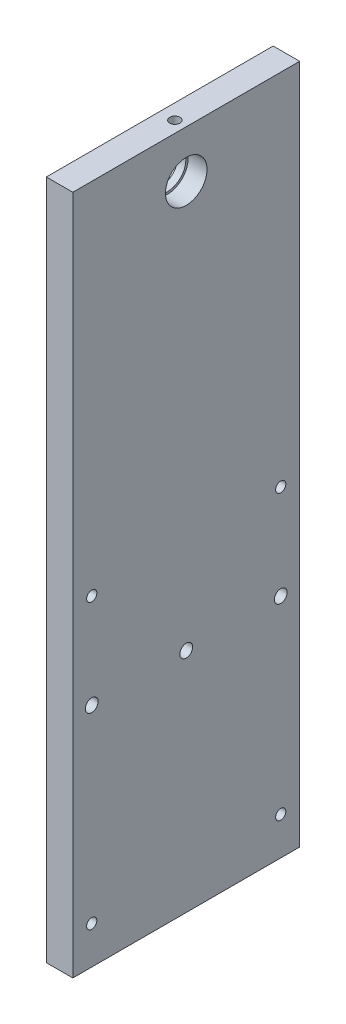
ISO-10303-21;
HEADER;
FILE_DESCRIPTION(('STEP AP214'),'2;1');
FILE_NAME('part.step','',(''),(''),'','','');
FILE_SCHEMA(('AUTOMOTIVE_DESIGN { 1 0 10303 214 1 1 1 1 }'));
ENDSEC;
DATA;
#1=APPLICATION_CONTEXT('core data for automotive mechanical design processes');
#2=APPLICATION_PROTOCOL_DEFINITION('international standard','automotive_design',2000,#1);
#3=PRODUCT_CONTEXT('',#1,'mechanical');
#4=PRODUCT('Part','Part','',(#3));
#5=PRODUCT_RELATED_PRODUCT_CATEGORY('part','',(#4));
#6=PRODUCT_DEFINITION_FORMATION('','',#4);
#7=PRODUCT_DEFINITION_CONTEXT('part definition',#1,'design');
#8=PRODUCT_DEFINITION('design','',#6,#7);
#9=PRODUCT_DEFINITION_SHAPE('','',#8);
#10=(LENGTH_UNIT() NAMED_UNIT(*) SI_UNIT(.MILLI.,.METRE.));
#11=(NAMED_UNIT(*) PLANE_ANGLE_UNIT() SI_UNIT($,.RADIAN.));
#12=(NAMED_UNIT(*) SI_UNIT($,.STERADIAN.) SOLID_ANGLE_UNIT());
#13=UNCERTAINTY_MEASURE_WITH_UNIT(LENGTH_MEASURE(1.E-05),#10,'distance_accuracy_value','');
#14=(GEOMETRIC_REPRESENTATION_CONTEXT(3) GLOBAL_UNCERTAINTY_ASSIGNED_CONTEXT((#13)) GLOBAL_UNIT_ASSIGNED_CONTEXT((#10,
#11,#12)) REPRESENTATION_CONTEXT('',''));
#15=CARTESIAN_POINT('',(0.,0.,0.));
#16=DIRECTION('',(0.,0.,1.));
#17=DIRECTION('',(1.,0.,0.));
#18=AXIS2_PLACEMENT_3D('',#15,#16,#17);
#19=CARTESIAN_POINT('',(7.,-90.,-30.));
#20=DIRECTION('',(0.,0.,1.));
#21=DIRECTION('',(1.,0.,0.));
#22=AXIS2_PLACEMENT_3D('',#19,#20,#21);
#23=PLANE('',#22);
#24=DIRECTION('',(0.,1.,0.));
#25=VECTOR('',#24,1.);
#26=CARTESIAN_POINT('',(0.,-90.,-30.));
#27=LINE('',#26,#25);
#28=CARTESIAN_POINT('',(0.,-90.,-30.));
#29=VERTEX_POINT('',#28);
#30=CARTESIAN_POINT('',(0.,90.,-30.));
#31=VERTEX_POINT('',#30);
#32=EDGE_CURVE('E192',#29,#31,#27,.T.);
#33=ORIENTED_EDGE('',*,*,#32,.T.);
#34=DIRECTION('',(-1.,0.,0.));
#35=VECTOR('',#34,1.);
#36=CARTESIAN_POINT('',(7.,90.,-30.));
#37=LINE('',#36,#35);
#38=CARTESIAN_POINT('',(7.,90.,-30.));
#39=VERTEX_POINT('',#38);
#40=EDGE_CURVE('E11',#39,#31,#37,.T.);
#41=ORIENTED_EDGE('',*,*,#40,.F.);
#42=DIRECTION('',(0.,1.,0.));
#43=VECTOR('',#42,1.);
#44=CARTESIAN_POINT('',(7.,-90.,-30.));
#45=LINE('',#44,#43);
#46=CARTESIAN_POINT('',(7.,-90.,-30.));
#47=VERTEX_POINT('',#46);
#48=EDGE_CURVE('E208',#47,#39,#45,.T.);
#49=ORIENTED_EDGE('',*,*,#48,.F.);
#50=DIRECTION('',(-1.,0.,0.));
#51=VECTOR('',#50,1.);
#52=CARTESIAN_POINT('',(7.,-90.,-30.));
#53=LINE('',#52,#51);
#54=EDGE_CURVE('E194',#47,#29,#53,.T.);
#55=ORIENTED_EDGE('',*,*,#54,.T.);
#56=EDGE_LOOP('',(#33,#41,#49,#55));
#57=FACE_BOUND('',#56,.T.);
#58=ADVANCED_FACE('F37',(#57),#23,.F.);
#59=CARTESIAN_POINT('',(7.,90.,30.));
#60=DIRECTION('',(0.,-1.,0.));
#61=DIRECTION('',(0.,0.,-1.));
#62=AXIS2_PLACEMENT_3D('',#59,#60,#61);
#63=PLANE('',#62);
#64=CARTESIAN_POINT('',(4.,90.,0.));
#65=DIRECTION('',(0.,1.,0.));
#66=DIRECTION('',(0.,0.,1.));
#67=AXIS2_PLACEMENT_3D('',#64,#65,#66);
#68=CIRCLE('',#67,1.35);
#69=CARTESIAN_POINT('',(4.,90.,1.35));
#70=VERTEX_POINT('',#69);
#71=EDGE_CURVE('E125',#70,#70,#68,.T.);
#72=ORIENTED_EDGE('',*,*,#71,.F.);
#73=EDGE_LOOP('',(#72));
#74=FACE_BOUND('',#73,.T.);
#75=DIRECTION('',(0.,0.,1.));
#76=VECTOR('',#75,1.);
#77=CARTESIAN_POINT('',(0.,90.,30.));
#78=LINE('',#77,#76);
#79=CARTESIAN_POINT('',(0.,90.,30.));
#80=VERTEX_POINT('',#79);
#81=EDGE_CURVE('E196',#31,#80,#78,.T.);
#82=ORIENTED_EDGE('',*,*,#81,.T.);
#83=DIRECTION('',(-1.,0.,0.));
#84=VECTOR('',#83,1.);
#85=CARTESIAN_POINT('',(7.,90.,30.));
#86=LINE('',#85,#84);
#87=CARTESIAN_POINT('',(7.,90.,30.));
#88=VERTEX_POINT('',#87);
#89=EDGE_CURVE('E46',#88,#80,#86,.T.);
#90=ORIENTED_EDGE('',*,*,#89,.F.);
#91=DIRECTION('',(0.,0.,1.));
#92=VECTOR('',#91,1.);
#93=CARTESIAN_POINT('',(7.,90.,30.));
#94=LINE('',#93,#92);
#95=EDGE_CURVE('E86',#39,#88,#94,.T.);
#96=ORIENTED_EDGE('',*,*,#95,.F.);
#97=ORIENTED_EDGE('',*,*,#40,.T.);
#98=EDGE_LOOP('',(#82,#90,#96,#97));
#99=FACE_BOUND('',#98,.T.);
#100=ADVANCED_FACE('F182',(#74,#99),#63,.F.);
#101=CARTESIAN_POINT('',(7.,-90.,30.));
#102=DIRECTION('',(0.,0.,-1.));
#103=DIRECTION('',(-1.,0.,0.));
#104=AXIS2_PLACEMENT_3D('',#101,#102,#103);
#105=PLANE('',#104);
#106=DIRECTION('',(0.,-1.,0.));
#107=VECTOR('',#106,1.);
#108=CARTESIAN_POINT('',(0.,-90.,30.));
#109=LINE('',#108,#107);
#110=CARTESIAN_POINT('',(0.,-90.,30.));
#111=VERTEX_POINT('',#110);
#112=EDGE_CURVE('E73',#80,#111,#109,.T.);
#113=ORIENTED_EDGE('',*,*,#112,.T.);
#114=DIRECTION('',(-1.,0.,0.));
#115=VECTOR('',#114,1.);
#116=CARTESIAN_POINT('',(7.,-90.,30.));
#117=LINE('',#116,#115);
#118=CARTESIAN_POINT('',(7.,-90.,30.));
#119=VERTEX_POINT('',#118);
#120=EDGE_CURVE('E210',#119,#111,#117,.T.);
#121=ORIENTED_EDGE('',*,*,#120,.F.);
#122=DIRECTION('',(0.,-1.,0.));
#123=VECTOR('',#122,1.);
#124=CARTESIAN_POINT('',(7.,-90.,30.));
#125=LINE('',#124,#123);
#126=EDGE_CURVE('E243',#88,#119,#125,.T.);
#127=ORIENTED_EDGE('',*,*,#126,.F.);
#128=ORIENTED_EDGE('',*,*,#89,.T.);
#129=EDGE_LOOP('',(#113,#121,#127,#128));
#130=FACE_BOUND('',#129,.T.);
#131=ADVANCED_FACE('F187',(#130),#105,.F.);
#132=CARTESIAN_POINT('',(7.,-90.,30.));
#133=DIRECTION('',(0.,1.,0.));
#134=DIRECTION('',(0.,0.,1.));
#135=AXIS2_PLACEMENT_3D('',#132,#133,#134);
#136=PLANE('',#135);
#137=CARTESIAN_POINT('',(3.5,-90.,-25.));
#138=DIRECTION('',(0.,-1.,0.));
#139=DIRECTION('',(0.,0.,-1.));
#140=AXIS2_PLACEMENT_3D('',#137,#138,#139);
#141=CIRCLE('',#140,1.35);
#142=CARTESIAN_POINT('',(3.5,-90.,-26.35));
#143=VERTEX_POINT('',#142);
#144=EDGE_CURVE('E107',#143,#143,#141,.T.);
#145=ORIENTED_EDGE('',*,*,#144,.F.);
#146=EDGE_LOOP('',(#145));
#147=FACE_BOUND('',#146,.T.);
#148=CARTESIAN_POINT('',(3.5,-90.,0.));
#149=DIRECTION('',(0.,-1.,0.));
#150=DIRECTION('',(0.,0.,-1.));
#151=AXIS2_PLACEMENT_3D('',#148,#149,#150);
#152=CIRCLE('',#151,1.35);
#153=CARTESIAN_POINT('',(3.5,-90.,-1.35));
#154=VERTEX_POINT('',#153);
#155=EDGE_CURVE('E106',#154,#154,#152,.T.);
#156=ORIENTED_EDGE('',*,*,#155,.F.);
#157=EDGE_LOOP('',(#156));
#158=FACE_BOUND('',#157,.T.);
#159=CARTESIAN_POINT('',(3.5,-90.,25.));
#160=DIRECTION('',(0.,-1.,0.));
#161=DIRECTION('',(0.,0.,-1.));
#162=AXIS2_PLACEMENT_3D('',#159,#160,#161);
#163=CIRCLE('',#162,1.35);
#164=CARTESIAN_POINT('',(3.5,-90.,23.65));
#165=VERTEX_POINT('',#164);
#166=EDGE_CURVE('E119',#165,#165,#163,.T.);
#167=ORIENTED_EDGE('',*,*,#166,.F.);
#168=EDGE_LOOP('',(#167));
#169=FACE_BOUND('',#168,.T.);
#170=DIRECTION('',(0.,0.,-1.));
#171=VECTOR('',#170,1.);
#172=CARTESIAN_POINT('',(0.,-90.,30.));
#173=LINE('',#172,#171);
#174=EDGE_CURVE('E79',#111,#29,#173,.T.);
#175=ORIENTED_EDGE('',*,*,#174,.T.);
#176=ORIENTED_EDGE('',*,*,#54,.F.);
#177=DIRECTION('',(0.,0.,-1.));
#178=VECTOR('',#177,1.);
#179=CARTESIAN_POINT('',(7.,-90.,30.));
#180=LINE('',#179,#178);
#181=EDGE_CURVE('E55',#119,#47,#180,.T.);
#182=ORIENTED_EDGE('',*,*,#181,.F.);
#183=ORIENTED_EDGE('',*,*,#120,.T.);
#184=EDGE_LOOP('',(#175,#176,#182,#183));
#185=FACE_BOUND('',#184,.T.);
#186=ADVANCED_FACE('F246',(#147,#158,#169,#185),#136,.F.);
#187=CARTESIAN_POINT('',(7.,0.,0.));
#188=DIRECTION('',(-1.,0.,0.));
#189=DIRECTION('',(0.,0.,1.));
#190=AXIS2_PLACEMENT_3D('',#187,#188,#189);
#191=PLANE('',#190);
#192=CARTESIAN_POINT('',(7.,-4.99999999999999,25.));
#193=DIRECTION('',(-1.,0.,0.));
#194=DIRECTION('',(0.,0.,1.));
#195=AXIS2_PLACEMENT_3D('',#192,#193,#194);
#196=CIRCLE('',#195,1.35);
#197=CARTESIAN_POINT('',(7.,-4.99999999999999,26.35));
#198=VERTEX_POINT('',#197);
#199=EDGE_CURVE('E530',#198,#198,#196,.T.);
#200=ORIENTED_EDGE('',*,*,#199,.T.);
#201=EDGE_LOOP('',(#200));
#202=FACE_BOUND('',#201,.T.);
#203=CARTESIAN_POINT('',(7.,-80.,25.));
#204=DIRECTION('',(-1.,0.,0.));
#205=DIRECTION('',(0.,0.,1.));
#206=AXIS2_PLACEMENT_3D('',#203,#204,#205);
#207=CIRCLE('',#206,1.35);
#208=CARTESIAN_POINT('',(7.,-80.,26.35));
#209=VERTEX_POINT('',#208);
#210=EDGE_CURVE('E526',#209,#209,#207,.T.);
#211=ORIENTED_EDGE('',*,*,#210,.T.);
#212=EDGE_LOOP('',(#211));
#213=FACE_BOUND('',#212,.T.);
#214=CARTESIAN_POINT('',(7.,-80.,-25.));
#215=DIRECTION('',(-1.,0.,0.));
#216=DIRECTION('',(0.,0.,1.));
#217=AXIS2_PLACEMENT_3D('',#214,#215,#216);
#218=CIRCLE('',#217,1.35);
#219=CARTESIAN_POINT('',(7.,-80.,-23.65));
#220=VERTEX_POINT('',#219);
#221=EDGE_CURVE('E519',#220,#220,#218,.T.);
#222=ORIENTED_EDGE('',*,*,#221,.T.);
#223=EDGE_LOOP('',(#222));
#224=FACE_BOUND('',#223,.T.);
#225=CARTESIAN_POINT('',(7.,-4.99999999999999,-25.));
#226=DIRECTION('',(-1.,0.,0.));
#227=DIRECTION('',(0.,0.,1.));
#228=AXIS2_PLACEMENT_3D('',#225,#226,#227);
#229=CIRCLE('',#228,1.35);
#230=CARTESIAN_POINT('',(7.,-4.99999999999999,-23.65));
#231=VERTEX_POINT('',#230);
#232=EDGE_CURVE('E113',#231,#231,#229,.T.);
#233=ORIENTED_EDGE('',*,*,#232,.T.);
#234=EDGE_LOOP('',(#233));
#235=FACE_BOUND('',#234,.T.);
#236=CARTESIAN_POINT('',(7.,-30.,-25.));
#237=DIRECTION('',(-1.,0.,0.));
#238=DIRECTION('',(0.,0.,1.));
#239=AXIS2_PLACEMENT_3D('',#236,#237,#238);
#240=CIRCLE('',#239,1.69999999999999);
#241=CARTESIAN_POINT('',(7.,-30.,-23.3));
#242=VERTEX_POINT('',#241);
#243=EDGE_CURVE('E40',#242,#242,#240,.T.);
#244=ORIENTED_EDGE('',*,*,#243,.T.);
#245=EDGE_LOOP('',(#244));
#246=FACE_BOUND('',#245,.T.);
#247=CARTESIAN_POINT('',(7.,-30.,0.));
#248=DIRECTION('',(-1.,0.,0.));
#249=DIRECTION('',(0.,0.,1.));
#250=AXIS2_PLACEMENT_3D('',#247,#248,#249);
#251=CIRCLE('',#250,1.69999999999999);
#252=CARTESIAN_POINT('',(7.,-30.,1.69999999999999));
#253=VERTEX_POINT('',#252);
#254=EDGE_CURVE('E217',#253,#253,#251,.T.);
#255=ORIENTED_EDGE('',*,*,#254,.T.);
#256=EDGE_LOOP('',(#255));
#257=FACE_BOUND('',#256,.T.);
#258=CARTESIAN_POINT('',(7.,-30.,25.));
#259=DIRECTION('',(-1.,0.,0.));
#260=DIRECTION('',(0.,0.,1.));
#261=AXIS2_PLACEMENT_3D('',#258,#259,#260);
#262=CIRCLE('',#261,1.69999999999999);
#263=CARTESIAN_POINT('',(7.,-30.,26.7));
#264=VERTEX_POINT('',#263);
#265=EDGE_CURVE('E213',#264,#264,#262,.T.);
#266=ORIENTED_EDGE('',*,*,#265,.T.);
#267=EDGE_LOOP('',(#266));
#268=FACE_BOUND('',#267,.T.);
#269=CARTESIAN_POINT('',(7.,77.5,0.));
#270=DIRECTION('',(1.,0.,0.));
#271=DIRECTION('',(0.,0.,-1.));
#272=AXIS2_PLACEMENT_3D('',#269,#270,#271);
#273=CIRCLE('',#272,5.5);
#274=CARTESIAN_POINT('',(7.,77.5,-5.5));
#275=VERTEX_POINT('',#274);
#276=EDGE_CURVE('E201',#275,#275,#273,.T.);
#277=ORIENTED_EDGE('',*,*,#276,.F.);
#278=EDGE_LOOP('',(#277));
#279=FACE_BOUND('',#278,.T.);
#280=ORIENTED_EDGE('',*,*,#48,.T.);
#281=ORIENTED_EDGE('',*,*,#95,.T.);
#282=ORIENTED_EDGE('',*,*,#126,.T.);
#283=ORIENTED_EDGE('',*,*,#181,.T.);
#284=EDGE_LOOP('',(#280,#281,#282,#283));
#285=FACE_BOUND('',#284,.T.);
#286=ADVANCED_FACE('F245',(#202,#213,#224,#235,#246,#257,#268,#279,#285),#191,.F.);
#287=CARTESIAN_POINT('',(0.,0.,0.));
#288=DIRECTION('',(-1.,0.,0.));
#289=DIRECTION('',(0.,0.,1.));
#290=AXIS2_PLACEMENT_3D('',#287,#288,#289);
#291=PLANE('',#290);
#292=CARTESIAN_POINT('',(0.,-4.99999999999999,25.));
#293=DIRECTION('',(-1.,0.,0.));
#294=DIRECTION('',(0.,0.,1.));
#295=AXIS2_PLACEMENT_3D('',#292,#293,#294);
#296=CIRCLE('',#295,1.35);
#297=CARTESIAN_POINT('',(0.,-4.99999999999999,26.35));
#298=VERTEX_POINT('',#297);
#299=EDGE_CURVE('E506',#298,#298,#296,.T.);
#300=ORIENTED_EDGE('',*,*,#299,.F.);
#301=EDGE_LOOP('',(#300));
#302=FACE_BOUND('',#301,.T.);
#303=CARTESIAN_POINT('',(0.,-80.,25.));
#304=DIRECTION('',(-1.,0.,0.));
#305=DIRECTION('',(0.,0.,1.));
#306=AXIS2_PLACEMENT_3D('',#303,#304,#305);
#307=CIRCLE('',#306,1.35);
#308=CARTESIAN_POINT('',(0.,-80.,26.35));
#309=VERTEX_POINT('',#308);
#310=EDGE_CURVE('E510',#309,#309,#307,.T.);
#311=ORIENTED_EDGE('',*,*,#310,.F.);
#312=EDGE_LOOP('',(#311));
#313=FACE_BOUND('',#312,.T.);
#314=CARTESIAN_POINT('',(0.,-80.,-25.));
#315=DIRECTION('',(-1.,0.,0.));
#316=DIRECTION('',(0.,0.,1.));
#317=AXIS2_PLACEMENT_3D('',#314,#315,#316);
#318=CIRCLE('',#317,1.35);
#319=CARTESIAN_POINT('',(0.,-80.,-23.65));
#320=VERTEX_POINT('',#319);
#321=EDGE_CURVE('E514',#320,#320,#318,.T.);
#322=ORIENTED_EDGE('',*,*,#321,.F.);
#323=EDGE_LOOP('',(#322));
#324=FACE_BOUND('',#323,.T.);
#325=CARTESIAN_POINT('',(0.,-4.99999999999999,-25.));
#326=DIRECTION('',(-1.,0.,0.));
#327=DIRECTION('',(0.,0.,1.));
#328=AXIS2_PLACEMENT_3D('',#325,#326,#327);
#329=CIRCLE('',#328,1.35);
#330=CARTESIAN_POINT('',(0.,-4.99999999999999,-23.65));
#331=VERTEX_POINT('',#330);
#332=EDGE_CURVE('E517',#331,#331,#329,.T.);
#333=ORIENTED_EDGE('',*,*,#332,.F.);
#334=EDGE_LOOP('',(#333));
#335=FACE_BOUND('',#334,.T.);
#336=CARTESIAN_POINT('',(0.,-30.,-25.));
#337=DIRECTION('',(-1.,0.,0.));
#338=DIRECTION('',(0.,0.,1.));
#339=AXIS2_PLACEMENT_3D('',#336,#337,#338);
#340=CIRCLE('',#339,3.15);
#341=CARTESIAN_POINT('',(0.,-30.,-21.85));
#342=VERTEX_POINT('',#341);
#343=EDGE_CURVE('E135',#342,#342,#340,.T.);
#344=ORIENTED_EDGE('',*,*,#343,.F.);
#345=EDGE_LOOP('',(#344));
#346=FACE_BOUND('',#345,.T.);
#347=CARTESIAN_POINT('',(0.,-30.,0.));
#348=DIRECTION('',(-1.,0.,0.));
#349=DIRECTION('',(0.,0.,1.));
#350=AXIS2_PLACEMENT_3D('',#347,#348,#349);
#351=CIRCLE('',#350,3.15);
#352=CARTESIAN_POINT('',(0.,-30.,3.15));
#353=VERTEX_POINT('',#352);
#354=EDGE_CURVE('E226',#353,#353,#351,.T.);
#355=ORIENTED_EDGE('',*,*,#354,.F.);
#356=EDGE_LOOP('',(#355));
#357=FACE_BOUND('',#356,.T.);
#358=CARTESIAN_POINT('',(0.,-30.,25.));
#359=DIRECTION('',(-1.,0.,0.));
#360=DIRECTION('',(0.,0.,1.));
#361=AXIS2_PLACEMENT_3D('',#358,#359,#360);
#362=CIRCLE('',#361,3.15);
#363=CARTESIAN_POINT('',(0.,-30.,28.15));
#364=VERTEX_POINT('',#363);
#365=EDGE_CURVE('E219',#364,#364,#362,.T.);
#366=ORIENTED_EDGE('',*,*,#365,.F.);
#367=EDGE_LOOP('',(#366));
#368=FACE_BOUND('',#367,.T.);
#369=CARTESIAN_POINT('',(0.,77.5,0.));
#370=DIRECTION('',(1.,0.,0.));
#371=DIRECTION('',(0.,0.,-1.));
#372=AXIS2_PLACEMENT_3D('',#369,#370,#371);
#373=CIRCLE('',#372,4.9);
#374=CARTESIAN_POINT('',(0.,77.5,-4.9));
#375=VERTEX_POINT('',#374);
#376=EDGE_CURVE('E235',#375,#375,#373,.T.);
#377=ORIENTED_EDGE('',*,*,#376,.T.);
#378=EDGE_LOOP('',(#377));
#379=FACE_BOUND('',#378,.T.);
#380=ORIENTED_EDGE('',*,*,#32,.F.);
#381=ORIENTED_EDGE('',*,*,#174,.F.);
#382=ORIENTED_EDGE('',*,*,#112,.F.);
#383=ORIENTED_EDGE('',*,*,#81,.F.);
#384=EDGE_LOOP('',(#380,#381,#382,#383));
#385=FACE_BOUND('',#384,.T.);
#386=ADVANCED_FACE('F254',(#302,#313,#324,#335,#346,#357,#368,#379,#385),#291,.T.);
#387=CARTESIAN_POINT('',(2.,77.5,0.));
#388=DIRECTION('',(1.,0.,0.));
#389=DIRECTION('',(0.,0.,-1.));
#390=AXIS2_PLACEMENT_3D('',#387,#388,#389);
#391=CYLINDRICAL_SURFACE('',#390,5.5);
#392=CARTESIAN_POINT('',(4.,82.8317445550214,1.35));
#393=CARTESIAN_POINT('',(4.07459404554228,82.8317460030496,1.34999780468861));
#394=CARTESIAN_POINT('',(4.14921268427218,82.8333270611656,1.34379642023362));
#395=CARTESIAN_POINT('',(4.29631034850242,82.8394650177074,1.31919235824953));
#396=CARTESIAN_POINT('',(4.36878805553909,82.8440237115171,1.30078231933421));
#397=CARTESIAN_POINT('',(4.50945489998974,82.8555702383644,1.25239008377342));
#398=CARTESIAN_POINT('',(4.57764931970242,82.8625550071543,1.22242247963624));
#399=CARTESIAN_POINT('',(4.70804925189844,82.8781628839995,1.15180985590368));
#400=CARTESIAN_POINT('',(4.77025456657645,82.8867860461389,1.11116448381323));
#401=CARTESIAN_POINT('',(4.88823057177394,82.9049038833024,1.01942910306189));
#402=CARTESIAN_POINT('',(4.9438554652346,82.9144120708667,0.968154225253445));
#403=CARTESIAN_POINT('',(5.04580835602827,82.9331112465526,0.857013678934214));
#404=CARTESIAN_POINT('',(5.09213550790031,82.9423022057653,0.797147230023986));
#405=CARTESIAN_POINT('',(5.17477135301243,82.9594805058321,0.669527331244809));
#406=CARTESIAN_POINT('',(5.21093727225865,82.9674500410681,0.601678829076576));
#407=CARTESIAN_POINT('',(5.27129642301976,82.9811336171398,0.460637452762032));
#408=CARTESIAN_POINT('',(5.29549135549065,82.9868479783896,0.387445339585715));
#409=CARTESIAN_POINT('',(5.3307560165024,82.9952818339813,0.239313788270514));
#410=CARTESIAN_POINT('',(5.34207321350537,82.9980577207999,0.164436529241063));
#411=CARTESIAN_POINT('',(5.35203747060492,83.000498201627,0.0137982099228753));
#412=CARTESIAN_POINT('',(5.35068633908424,83.000163239704,-0.0619627226808936));
#413=CARTESIAN_POINT('',(5.33553124765317,82.9964619144129,-0.210503074693486));
#414=CARTESIAN_POINT('',(5.32199434512563,82.9931605637975,-0.283311604089842));
#415=CARTESIAN_POINT('',(5.2832806686568,82.9839728460825,-0.425590436159458));
#416=CARTESIAN_POINT('',(5.25810328787283,82.9780863442143,-0.495060564586371));
#417=CARTESIAN_POINT('',(5.19660423625448,82.9642894959193,-0.629399929606702));
#418=CARTESIAN_POINT('',(5.16018658722455,82.9563618209599,-0.694223375749242));
#419=CARTESIAN_POINT('',(5.07731336566687,82.9393440323317,-0.816933122260442));
#420=CARTESIAN_POINT('',(5.03085610331682,82.9302537230789,-0.874818252250094));
#421=CARTESIAN_POINT('',(4.92778726514464,82.9116226103587,-0.983600387239492));
#422=CARTESIAN_POINT('',(4.87094224165007,82.9020762416116,-1.03427548315651));
#423=CARTESIAN_POINT('',(4.74946102220943,82.8838269074008,-1.12542201012341));
#424=CARTESIAN_POINT('',(4.68482448869826,82.8751239785084,-1.16589299884805));
#425=CARTESIAN_POINT('',(4.54917160587664,82.8595276850636,-1.23561772227967));
#426=CARTESIAN_POINT('',(4.4781276837543,82.8526426959882,-1.26481981503145));
#427=CARTESIAN_POINT('',(4.33192952394116,82.8415703509379,-1.31079803732961));
#428=CARTESIAN_POINT('',(4.25677613342307,82.8373824412138,-1.32757671768675));
#429=CARTESIAN_POINT('',(4.10654570733195,82.8322941697872,-1.3478673650254));
#430=CARTESIAN_POINT('',(4.03151557787121,82.8313127113433,-1.35170667221183));
#431=CARTESIAN_POINT('',(3.88188678506865,82.8325280215256,-1.34690423887276));
#432=CARTESIAN_POINT('',(3.80728808417937,82.8347245092638,-1.33826360140847));
#433=CARTESIAN_POINT('',(3.66184347728384,82.8419706814126,-1.30903313486459));
#434=CARTESIAN_POINT('',(3.59095712642133,82.8469752072159,-1.28863229355618));
#435=CARTESIAN_POINT('',(3.4536100628248,82.8592310238128,-1.23666930120605));
#436=CARTESIAN_POINT('',(3.38714986071415,82.866482573291,-1.20510586503111));
#437=CARTESIAN_POINT('',(3.25915015106879,82.8825872478439,-1.13102304528637));
#438=CARTESIAN_POINT('',(3.19772801442858,82.8914681646624,-1.08830704308625));
#439=CARTESIAN_POINT('',(3.0828032982913,82.9097619766563,-0.993381558501934));
#440=CARTESIAN_POINT('',(3.02930197371111,82.919174955802,-0.941170574714357));
#441=CARTESIAN_POINT('',(2.93042011982838,82.9377459872019,-0.827238089249232));
#442=CARTESIAN_POINT('',(2.8852655443547,82.9468924835964,-0.76531825276484));
#443=CARTESIAN_POINT('',(2.8059961025652,82.9636653749563,-0.63458432139681));
#444=CARTESIAN_POINT('',(2.77188066643723,82.9712918483735,-0.565770582598971));
#445=CARTESIAN_POINT('',(2.71594867747293,82.9841178391087,-0.423673158542756));
#446=CARTESIAN_POINT('',(2.69404489670396,82.9893345223853,-0.350425429906179));
#447=CARTESIAN_POINT('',(2.66289421984003,82.9968281760098,-0.201144300271241));
#448=CARTESIAN_POINT('',(2.65364497482473,82.999105691918,-0.125111418940748));
#449=CARTESIAN_POINT('',(2.64819405112427,83.000443052028,0.0254557407383851));
#450=CARTESIAN_POINT('',(2.65165835303451,82.9995852713922,0.0999773817699713));
#451=CARTESIAN_POINT('',(2.67077387021999,82.9949301430865,0.24734206909767));
#452=CARTESIAN_POINT('',(2.68642474666354,82.991132877145,0.320185162005634));
#453=CARTESIAN_POINT('',(2.7292927234215,82.9810371975396,0.461789217233674));
#454=CARTESIAN_POINT('',(2.75645138836129,82.9747514306778,0.530568830035222));
#455=CARTESIAN_POINT('',(2.82151061524929,82.9603419872164,0.662633560373051));
#456=CARTESIAN_POINT('',(2.85941248775173,82.9522180864089,0.725918006327704));
#457=CARTESIAN_POINT('',(2.94591172001443,82.9347742019884,0.846787012549155));
#458=CARTESIAN_POINT('',(2.99473701548843,82.925430823468,0.904205079234397));
#459=CARTESIAN_POINT('',(3.10125190537252,82.9067092325107,1.01014645876724));
#460=CARTESIAN_POINT('',(3.15894372382113,82.8973310119116,1.05866753321807));
#461=CARTESIAN_POINT('',(3.28279089151666,82.8794120039078,1.14628389085835));
#462=CARTESIAN_POINT('',(3.34907867896656,82.8708891063509,1.18519590593834));
#463=CARTESIAN_POINT('',(3.48745401003528,82.855883763097,1.25126542712516));
#464=CARTESIAN_POINT('',(3.55953717751762,82.8493997956252,1.27843170548016));
#465=CARTESIAN_POINT('',(3.69293917888424,82.8402488279476,1.31606861111387));
#466=CARTESIAN_POINT('',(3.75360526885057,82.8370832726278,1.32876567963174));
#467=CARTESIAN_POINT('',(3.8761753222825,82.8328306169818,1.34573195345692));
#468=CARTESIAN_POINT('',(3.93807918789571,82.8317433530075,1.35000182233666));
#469=CARTESIAN_POINT('',(4.,82.8317445550214,1.35));
#470=B_SPLINE_CURVE_WITH_KNOTS('',3,(#392,#393,#394,#395,#396,#397,#398,#399,#400,#401,#402,
#403,#404,#405,#406,#407,#408,#409,#410,#411,#412,#413,#414,#415,#416,#417,#418,#419,#420,#421,
#422,#423,#424,#425,#426,#427,#428,#429,#430,#431,#432,#433,#434,#435,#436,#437,#438,#439,#440,
#441,#442,#443,#444,#445,#446,#447,#448,#449,#450,#451,#452,#453,#454,#455,#456,#457,#458,#459,
#460,#461,#462,#463,#464,#465,#466,#467,#468,#469),.UNSPECIFIED.,.T.,.F.,(4,2,2,2,2,2,2,2,2,2,2,
2,2,2,2,2,2,2,2,2,2,2,2,2,2,2,2,2,2,2,2,2,2,2,2,2,2,2,4),(0.,0.223554818267302,
0.447244554882467,0.670652782015689,0.894068385240816,1.12175636336588,1.34946503621187,
1.58022921421381,1.81096059353956,2.03717893719261,2.26336498904638,2.4847115978757,
2.70606974727192,2.92937291485706,3.15271369713594,3.38188561694339,3.61106746913429,
3.84128746156647,4.07146017144987,4.29576441656037,4.52004883737046,4.74082565483416,
4.96162789828865,5.18662199054073,5.41165169119046,5.64208711421159,5.87251064084755,
6.10126644247825,6.32997977695718,6.55272772341804,6.77546947688605,6.99709347482238,
7.21874452011498,7.4455428482114,7.67239815850488,7.9032938446823,8.13401678837563,
8.31960514095422,8.50517887939813),.UNSPECIFIED.);
#471=CARTESIAN_POINT('',(4.,82.8317445550214,1.35));
#472=VERTEX_POINT('',#471);
#473=EDGE_CURVE('E128',#472,#472,#470,.T.);
#474=ORIENTED_EDGE('',*,*,#473,.T.);
#475=EDGE_LOOP('',(#474));
#476=FACE_BOUND('',#475,.T.);
#477=CARTESIAN_POINT('',(2.,77.5,0.));
#478=DIRECTION('',(1.,0.,0.));
#479=DIRECTION('',(0.,0.,-1.));
#480=AXIS2_PLACEMENT_3D('',#477,#478,#479);
#481=CIRCLE('',#480,5.5);
#482=CARTESIAN_POINT('',(2.,77.5,-5.5));
#483=VERTEX_POINT('',#482);
#484=EDGE_CURVE('E197',#483,#483,#481,.T.);
#485=ORIENTED_EDGE('',*,*,#484,.F.);
#486=EDGE_LOOP('',(#485));
#487=FACE_BOUND('',#486,.T.);
#488=ORIENTED_EDGE('',*,*,#276,.T.);
#489=EDGE_LOOP('',(#488));
#490=FACE_BOUND('',#489,.T.);
#491=ADVANCED_FACE('F262',(#476,#487,#490),#391,.F.);
#492=CARTESIAN_POINT('',(2.,77.5,0.));
#493=DIRECTION('',(1.,0.,0.));
#494=DIRECTION('',(0.,0.,-1.));
#495=AXIS2_PLACEMENT_3D('',#492,#493,#494);
#496=PLANE('',#495);
#497=CARTESIAN_POINT('',(2.,77.5,0.));
#498=DIRECTION('',(1.,0.,0.));
#499=DIRECTION('',(0.,0.,-1.));
#500=AXIS2_PLACEMENT_3D('',#497,#498,#499);
#501=CIRCLE('',#500,4.9);
#502=CARTESIAN_POINT('',(2.,77.5,-4.9));
#503=VERTEX_POINT('',#502);
#504=EDGE_CURVE('E215',#503,#503,#501,.T.);
#505=ORIENTED_EDGE('',*,*,#504,.F.);
#506=EDGE_LOOP('',(#505));
#507=FACE_BOUND('',#506,.T.);
#508=ORIENTED_EDGE('',*,*,#484,.T.);
#509=EDGE_LOOP('',(#508));
#510=FACE_BOUND('',#509,.T.);
#511=ADVANCED_FACE('F267',(#507,#510),#496,.T.);
#512=CARTESIAN_POINT('',(0.,77.5,0.));
#513=DIRECTION('',(1.,0.,0.));
#514=DIRECTION('',(0.,0.,-1.));
#515=AXIS2_PLACEMENT_3D('',#512,#513,#514);
#516=CYLINDRICAL_SURFACE('',#515,4.9);
#517=ORIENTED_EDGE('',*,*,#376,.F.);
#518=EDGE_LOOP('',(#517));
#519=FACE_BOUND('',#518,.T.);
#520=ORIENTED_EDGE('',*,*,#504,.T.);
#521=EDGE_LOOP('',(#520));
#522=FACE_BOUND('',#521,.T.);
#523=ADVANCED_FACE('F271',(#519,#522),#516,.F.);
#524=CARTESIAN_POINT('',(0.,-30.,25.));
#525=DIRECTION('',(-1.,0.,0.));
#526=DIRECTION('',(0.,0.,1.));
#527=AXIS2_PLACEMENT_3D('',#524,#525,#526);
#528=CYLINDRICAL_SURFACE('',#527,1.69999999999999);
#529=CARTESIAN_POINT('',(1.45,-30.,25.));
#530=DIRECTION('',(-1.,0.,0.));
#531=DIRECTION('',(0.,0.,1.));
#532=AXIS2_PLACEMENT_3D('',#529,#530,#531);
#533=CIRCLE('',#532,1.7);
#534=CARTESIAN_POINT('',(1.45,-30.,26.7));
#535=VERTEX_POINT('',#534);
#536=EDGE_CURVE('E216',#535,#535,#533,.T.);
#537=ORIENTED_EDGE('',*,*,#536,.T.);
#538=EDGE_LOOP('',(#537));
#539=FACE_BOUND('',#538,.T.);
#540=ORIENTED_EDGE('',*,*,#265,.F.);
#541=EDGE_LOOP('',(#540));
#542=FACE_BOUND('',#541,.T.);
#543=ADVANCED_FACE('F275',(#539,#542),#528,.F.);
#544=CARTESIAN_POINT('',(0.,-30.,25.));
#545=DIRECTION('',(-1.,0.,0.));
#546=DIRECTION('',(0.,0.,1.));
#547=AXIS2_PLACEMENT_3D('',#544,#545,#546);
#548=CONICAL_SURFACE('',#547,3.15,0.785398163397448);
#549=ORIENTED_EDGE('',*,*,#536,.F.);
#550=EDGE_LOOP('',(#549));
#551=FACE_BOUND('',#550,.T.);
#552=ORIENTED_EDGE('',*,*,#365,.T.);
#553=EDGE_LOOP('',(#552));
#554=FACE_BOUND('',#553,.T.);
#555=ADVANCED_FACE('F279',(#551,#554),#548,.F.);
#556=CARTESIAN_POINT('',(0.,-30.,0.));
#557=DIRECTION('',(-1.,0.,0.));
#558=DIRECTION('',(0.,0.,1.));
#559=AXIS2_PLACEMENT_3D('',#556,#557,#558);
#560=CYLINDRICAL_SURFACE('',#559,1.69999999999999);
#561=CARTESIAN_POINT('',(1.45,-30.,0.));
#562=DIRECTION('',(-1.,0.,0.));
#563=DIRECTION('',(0.,0.,1.));
#564=AXIS2_PLACEMENT_3D('',#561,#562,#563);
#565=CIRCLE('',#564,1.7);
#566=CARTESIAN_POINT('',(1.45,-30.,1.7));
#567=VERTEX_POINT('',#566);
#568=EDGE_CURVE('E220',#567,#567,#565,.T.);
#569=ORIENTED_EDGE('',*,*,#568,.T.);
#570=EDGE_LOOP('',(#569));
#571=FACE_BOUND('',#570,.T.);
#572=ORIENTED_EDGE('',*,*,#254,.F.);
#573=EDGE_LOOP('',(#572));
#574=FACE_BOUND('',#573,.T.);
#575=ADVANCED_FACE('F283',(#571,#574),#560,.F.);
#576=CARTESIAN_POINT('',(0.,-30.,0.));
#577=DIRECTION('',(-1.,0.,0.));
#578=DIRECTION('',(0.,0.,1.));
#579=AXIS2_PLACEMENT_3D('',#576,#577,#578);
#580=CONICAL_SURFACE('',#579,3.15,0.785398163397448);
#581=ORIENTED_EDGE('',*,*,#568,.F.);
#582=EDGE_LOOP('',(#581));
#583=FACE_BOUND('',#582,.T.);
#584=ORIENTED_EDGE('',*,*,#354,.T.);
#585=EDGE_LOOP('',(#584));
#586=FACE_BOUND('',#585,.T.);
#587=ADVANCED_FACE('F287',(#583,#586),#580,.F.);
#588=CARTESIAN_POINT('',(0.,-30.,-25.));
#589=DIRECTION('',(-1.,0.,0.));
#590=DIRECTION('',(0.,0.,1.));
#591=AXIS2_PLACEMENT_3D('',#588,#589,#590);
#592=CYLINDRICAL_SURFACE('',#591,1.69999999999999);
#593=CARTESIAN_POINT('',(1.45,-30.,-25.));
#594=DIRECTION('',(-1.,0.,0.));
#595=DIRECTION('',(0.,0.,1.));
#596=AXIS2_PLACEMENT_3D('',#593,#594,#595);
#597=CIRCLE('',#596,1.7);
#598=CARTESIAN_POINT('',(1.45,-30.,-23.3));
#599=VERTEX_POINT('',#598);
#600=EDGE_CURVE('E301',#599,#599,#597,.T.);
#601=ORIENTED_EDGE('',*,*,#600,.T.);
#602=EDGE_LOOP('',(#601));
#603=FACE_BOUND('',#602,.T.);
#604=ORIENTED_EDGE('',*,*,#243,.F.);
#605=EDGE_LOOP('',(#604));
#606=FACE_BOUND('',#605,.T.);
#607=ADVANCED_FACE('F290',(#603,#606),#592,.F.);
#608=CARTESIAN_POINT('',(0.,-30.,-25.));
#609=DIRECTION('',(-1.,0.,0.));
#610=DIRECTION('',(0.,0.,1.));
#611=AXIS2_PLACEMENT_3D('',#608,#609,#610);
#612=CONICAL_SURFACE('',#611,3.15,0.785398163397448);
#613=ORIENTED_EDGE('',*,*,#600,.F.);
#614=EDGE_LOOP('',(#613));
#615=FACE_BOUND('',#614,.T.);
#616=ORIENTED_EDGE('',*,*,#343,.T.);
#617=EDGE_LOOP('',(#616));
#618=FACE_BOUND('',#617,.T.);
#619=ADVANCED_FACE('F144',(#615,#618),#612,.F.);
#620=CARTESIAN_POINT('',(4.,90.,0.));
#621=DIRECTION('',(0.,1.,0.));
#622=DIRECTION('',(0.,0.,1.));
#623=AXIS2_PLACEMENT_3D('',#620,#621,#622);
#624=CYLINDRICAL_SURFACE('',#623,1.35);
#625=ORIENTED_EDGE('',*,*,#473,.F.);
#626=EDGE_LOOP('',(#625));
#627=FACE_BOUND('',#626,.T.);
#628=ORIENTED_EDGE('',*,*,#71,.T.);
#629=EDGE_LOOP('',(#628));
#630=FACE_BOUND('',#629,.T.);
#631=ADVANCED_FACE('F139',(#627,#630),#624,.F.);
#632=CARTESIAN_POINT('',(3.5,-82.5,25.));
#633=DIRECTION('',(0.,-1.,0.));
#634=DIRECTION('',(0.,0.,-1.));
#635=AXIS2_PLACEMENT_3D('',#632,#633,#634);
#636=CONICAL_SURFACE('',#635,1.35,1.02974425867665);
#637=CARTESIAN_POINT('',(3.5,-81.6888381643128,25.));
#638=VERTEX_POINT('',#637);
#639=VERTEX_LOOP('',#638);
#640=FACE_BOUND('',#639,.T.);
#641=CARTESIAN_POINT('',(3.5,-82.5,25.));
#642=DIRECTION('',(0.,-1.,0.));
#643=DIRECTION('',(0.,0.,-1.));
#644=AXIS2_PLACEMENT_3D('',#641,#642,#643);
#645=CIRCLE('',#644,1.35);
#646=CARTESIAN_POINT('',(3.5,-82.5,23.65));
#647=VERTEX_POINT('',#646);
#648=EDGE_CURVE('E122',#647,#647,#645,.T.);
#649=ORIENTED_EDGE('',*,*,#648,.T.);
#650=EDGE_LOOP('',(#649));
#651=FACE_BOUND('',#650,.T.);
#652=ADVANCED_FACE('F143',(#640,#651),#636,.F.);
#653=CARTESIAN_POINT('',(3.5,-90.,25.));
#654=DIRECTION('',(0.,-1.,0.));
#655=DIRECTION('',(0.,0.,-1.));
#656=AXIS2_PLACEMENT_3D('',#653,#654,#655);
#657=CYLINDRICAL_SURFACE('',#656,1.35);
#658=ORIENTED_EDGE('',*,*,#648,.F.);
#659=EDGE_LOOP('',(#658));
#660=FACE_BOUND('',#659,.T.);
#661=ORIENTED_EDGE('',*,*,#166,.T.);
#662=EDGE_LOOP('',(#661));
#663=FACE_BOUND('',#662,.T.);
#664=ADVANCED_FACE('F148',(#660,#663),#657,.F.);
#665=CARTESIAN_POINT('',(3.5,-82.5,0.));
#666=DIRECTION('',(0.,-1.,0.));
#667=DIRECTION('',(0.,0.,-1.));
#668=AXIS2_PLACEMENT_3D('',#665,#666,#667);
#669=CONICAL_SURFACE('',#668,1.35,1.02974425867665);
#670=CARTESIAN_POINT('',(3.5,-81.6888381643128,0.));
#671=VERTEX_POINT('',#670);
#672=VERTEX_LOOP('',#671);
#673=FACE_BOUND('',#672,.T.);
#674=CARTESIAN_POINT('',(3.5,-82.5,0.));
#675=DIRECTION('',(0.,-1.,0.));
#676=DIRECTION('',(0.,0.,-1.));
#677=AXIS2_PLACEMENT_3D('',#674,#675,#676);
#678=CIRCLE('',#677,1.35);
#679=CARTESIAN_POINT('',(3.5,-82.5,-1.35));
#680=VERTEX_POINT('',#679);
#681=EDGE_CURVE('E110',#680,#680,#678,.T.);
#682=ORIENTED_EDGE('',*,*,#681,.T.);
#683=EDGE_LOOP('',(#682));
#684=FACE_BOUND('',#683,.T.);
#685=ADVANCED_FACE('F152',(#673,#684),#669,.F.);
#686=CARTESIAN_POINT('',(3.5,-90.,0.));
#687=DIRECTION('',(0.,-1.,0.));
#688=DIRECTION('',(0.,0.,-1.));
#689=AXIS2_PLACEMENT_3D('',#686,#687,#688);
#690=CYLINDRICAL_SURFACE('',#689,1.35);
#691=ORIENTED_EDGE('',*,*,#681,.F.);
#692=EDGE_LOOP('',(#691));
#693=FACE_BOUND('',#692,.T.);
#694=ORIENTED_EDGE('',*,*,#155,.T.);
#695=EDGE_LOOP('',(#694));
#696=FACE_BOUND('',#695,.T.);
#697=ADVANCED_FACE('F100',(#693,#696),#690,.F.);
#698=CARTESIAN_POINT('',(3.5,-82.5,-25.));
#699=DIRECTION('',(0.,-1.,0.));
#700=DIRECTION('',(0.,0.,-1.));
#701=AXIS2_PLACEMENT_3D('',#698,#699,#700);
#702=CONICAL_SURFACE('',#701,1.35,1.02974425867665);
#703=CARTESIAN_POINT('',(3.5,-81.6888381643128,-25.));
#704=VERTEX_POINT('',#703);
#705=VERTEX_LOOP('',#704);
#706=FACE_BOUND('',#705,.T.);
#707=CARTESIAN_POINT('',(3.5,-82.5,-25.));
#708=DIRECTION('',(0.,-1.,0.));
#709=DIRECTION('',(0.,0.,-1.));
#710=AXIS2_PLACEMENT_3D('',#707,#708,#709);
#711=CIRCLE('',#710,1.35);
#712=CARTESIAN_POINT('',(3.5,-82.5,-26.35));
#713=VERTEX_POINT('',#712);
#714=EDGE_CURVE('E104',#713,#713,#711,.T.);
#715=ORIENTED_EDGE('',*,*,#714,.T.);
#716=EDGE_LOOP('',(#715));
#717=FACE_BOUND('',#716,.T.);
#718=ADVANCED_FACE('F96',(#706,#717),#702,.F.);
#719=CARTESIAN_POINT('',(3.5,-90.,-25.));
#720=DIRECTION('',(0.,-1.,0.));
#721=DIRECTION('',(0.,0.,-1.));
#722=AXIS2_PLACEMENT_3D('',#719,#720,#721);
#723=CYLINDRICAL_SURFACE('',#722,1.35);
#724=ORIENTED_EDGE('',*,*,#714,.F.);
#725=EDGE_LOOP('',(#724));
#726=FACE_BOUND('',#725,.T.);
#727=ORIENTED_EDGE('',*,*,#144,.T.);
#728=EDGE_LOOP('',(#727));
#729=FACE_BOUND('',#728,.T.);
#730=ADVANCED_FACE('F99',(#726,#729),#723,.F.);
#731=CARTESIAN_POINT('',(0.,-4.99999999999999,-25.));
#732=DIRECTION('',(-1.,0.,0.));
#733=DIRECTION('',(0.,0.,1.));
#734=AXIS2_PLACEMENT_3D('',#731,#732,#733);
#735=CYLINDRICAL_SURFACE('',#734,1.35);
#736=ORIENTED_EDGE('',*,*,#232,.F.);
#737=EDGE_LOOP('',(#736));
#738=FACE_BOUND('',#737,.T.);
#739=ORIENTED_EDGE('',*,*,#332,.T.);
#740=EDGE_LOOP('',(#739));
#741=FACE_BOUND('',#740,.T.);
#742=ADVANCED_FACE('F162',(#738,#741),#735,.F.);
#743=CARTESIAN_POINT('',(0.,-80.,-25.));
#744=DIRECTION('',(-1.,0.,0.));
#745=DIRECTION('',(0.,0.,1.));
#746=AXIS2_PLACEMENT_3D('',#743,#744,#745);
#747=CYLINDRICAL_SURFACE('',#746,1.35);
#748=ORIENTED_EDGE('',*,*,#221,.F.);
#749=EDGE_LOOP('',(#748));
#750=FACE_BOUND('',#749,.T.);
#751=ORIENTED_EDGE('',*,*,#321,.T.);
#752=EDGE_LOOP('',(#751));
#753=FACE_BOUND('',#752,.T.);
#754=ADVANCED_FACE('F165',(#750,#753),#747,.F.);
#755=CARTESIAN_POINT('',(0.,-80.,25.));
#756=DIRECTION('',(-1.,0.,0.));
#757=DIRECTION('',(0.,0.,1.));
#758=AXIS2_PLACEMENT_3D('',#755,#756,#757);
#759=CYLINDRICAL_SURFACE('',#758,1.35);
#760=ORIENTED_EDGE('',*,*,#210,.F.);
#761=EDGE_LOOP('',(#760));
#762=FACE_BOUND('',#761,.T.);
#763=ORIENTED_EDGE('',*,*,#310,.T.);
#764=EDGE_LOOP('',(#763));
#765=FACE_BOUND('',#764,.T.);
#766=ADVANCED_FACE('F169',(#762,#765),#759,.F.);
#767=CARTESIAN_POINT('',(0.,-4.99999999999999,25.));
#768=DIRECTION('',(-1.,0.,0.));
#769=DIRECTION('',(0.,0.,1.));
#770=AXIS2_PLACEMENT_3D('',#767,#768,#769);
#771=CYLINDRICAL_SURFACE('',#770,1.35);
#772=ORIENTED_EDGE('',*,*,#199,.F.);
#773=EDGE_LOOP('',(#772));
#774=FACE_BOUND('',#773,.T.);
#775=ORIENTED_EDGE('',*,*,#299,.T.);
#776=EDGE_LOOP('',(#775));
#777=FACE_BOUND('',#776,.T.);
#778=ADVANCED_FACE('F173',(#774,#777),#771,.F.);
#779=CLOSED_SHELL('',(#58,#100,#131,#186,#286,#386,#491,#511,#523,#543,#555,#575,#587,#607,#619,
#631,#652,#664,#685,#697,#718,#730,#742,#754,#766,#778));
#780=MANIFOLD_SOLID_BREP('B2',#779);
#781=ADVANCED_BREP_SHAPE_REPRESENTATION('',(#18,#780),#14);
#782=SHAPE_DEFINITION_REPRESENTATION(#9,#781);
ENDSEC;
END-ISO-10303-21;
